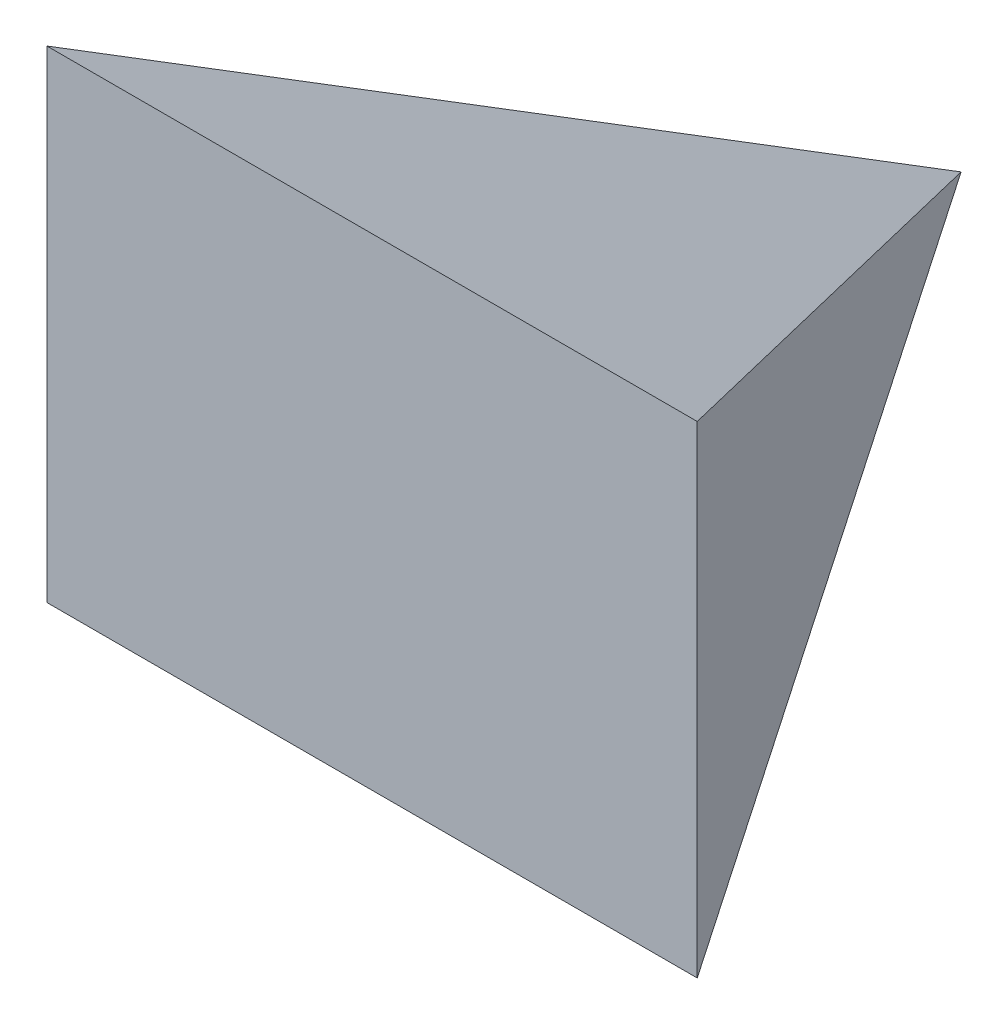
ISO-10303-21;
HEADER;
FILE_DESCRIPTION(('STEP AP214'),'2;1');
FILE_NAME('part.step','',(''),(''),'','','');
FILE_SCHEMA(('AUTOMOTIVE_DESIGN { 1 0 10303 214 1 1 1 1 }'));
ENDSEC;
DATA;
#1=APPLICATION_CONTEXT('core data for automotive mechanical design processes');
#2=APPLICATION_PROTOCOL_DEFINITION('international standard','automotive_design',2000,#1);
#3=PRODUCT_CONTEXT('',#1,'mechanical');
#4=PRODUCT('Part','Part','',(#3));
#5=PRODUCT_RELATED_PRODUCT_CATEGORY('part','',(#4));
#6=PRODUCT_DEFINITION_FORMATION('','',#4);
#7=PRODUCT_DEFINITION_CONTEXT('part definition',#1,'design');
#8=PRODUCT_DEFINITION('design','',#6,#7);
#9=PRODUCT_DEFINITION_SHAPE('','',#8);
#10=(LENGTH_UNIT() NAMED_UNIT(*) SI_UNIT(.MILLI.,.METRE.));
#11=(NAMED_UNIT(*) PLANE_ANGLE_UNIT() SI_UNIT($,.RADIAN.));
#12=(NAMED_UNIT(*) SI_UNIT($,.STERADIAN.) SOLID_ANGLE_UNIT());
#13=UNCERTAINTY_MEASURE_WITH_UNIT(LENGTH_MEASURE(1.E-05),#10,'distance_accuracy_value','');
#14=(GEOMETRIC_REPRESENTATION_CONTEXT(3) GLOBAL_UNCERTAINTY_ASSIGNED_CONTEXT((#13)) GLOBAL_UNIT_ASSIGNED_CONTEXT((#10,
#11,#12)) REPRESENTATION_CONTEXT('',''));
#15=CARTESIAN_POINT('',(0.,0.,0.));
#16=DIRECTION('',(0.,0.,1.));
#17=DIRECTION('',(1.,0.,0.));
#18=AXIS2_PLACEMENT_3D('',#15,#16,#17);
#19=CARTESIAN_POINT('',(165.608897339706,250.,300.));
#20=DIRECTION('',(-0.875464527000019,0.,0.483282383255));
#21=DIRECTION('',(0.483282383255,0.,0.875464527000019));
#22=AXIS2_PLACEMENT_3D('',#19,#20,#21);
#23=PLANE('',#22);
#24=DIRECTION('',(0.45498022040098,-0.337187178210936,0.824195247434746));
#25=VECTOR('',#24,1.);
#26=CARTESIAN_POINT('',(127.603274686984,30.432838191824,231.152933332871));
#27=LINE('',#26,#25);
#28=CARTESIAN_POINT('',(0.,125.,0.));
#29=VERTEX_POINT('',#28);
#30=CARTESIAN_POINT('',(165.608897339706,2.266759571688,300.));
#31=VERTEX_POINT('',#30);
#32=EDGE_CURVE('E64',#29,#31,#27,.T.);
#33=ORIENTED_EDGE('',*,*,#32,.F.);
#34=DIRECTION('',(-0.45498022040098,-0.337187178210936,-0.824195247434746));
#35=VECTOR('',#34,1.);
#36=CARTESIAN_POINT('',(165.956648851683,247.990960095639,300.629950777217));
#37=LINE('',#36,#35);
#38=CARTESIAN_POINT('',(165.608897339706,247.733240428312,300.));
#39=VERTEX_POINT('',#38);
#40=EDGE_CURVE('E78',#39,#29,#37,.T.);
#41=ORIENTED_EDGE('',*,*,#40,.F.);
#42=DIRECTION('',(0.,-1.,0.));
#43=VECTOR('',#42,1.);
#44=CARTESIAN_POINT('',(165.608897339706,250.,300.));
#45=LINE('',#44,#43);
#46=EDGE_CURVE('E42',#39,#31,#45,.T.);
#47=ORIENTED_EDGE('',*,*,#46,.T.);
#48=EDGE_LOOP('',(#33,#41,#47));
#49=FACE_BOUND('',#48,.T.);
#50=ADVANCED_FACE('F35',(#49),#23,.F.);
#51=CARTESIAN_POINT('',(0.,250.,0.));
#52=DIRECTION('',(0.875464527000019,0.,0.483282383255));
#53=DIRECTION('',(0.483282383255,0.,-0.875464527000019));
#54=AXIS2_PLACEMENT_3D('',#51,#52,#53);
#55=PLANE('',#54);
#56=DIRECTION('',(0.45498022040098,0.337187178210936,-0.824195247434746));
#57=VECTOR('',#56,1.);
#58=CARTESIAN_POINT('',(19.1766870823495,139.211899143732,-34.7385087221733));
#59=LINE('',#58,#57);
#60=CARTESIAN_POINT('',(-165.608897339706,2.266759571688,300.));
#61=VERTEX_POINT('',#60);
#62=EDGE_CURVE('E57',#61,#29,#59,.T.);
#63=ORIENTED_EDGE('',*,*,#62,.F.);
#64=DIRECTION('',(0.,-1.,0.));
#65=VECTOR('',#64,1.);
#66=CARTESIAN_POINT('',(-165.608897339706,250.,300.));
#67=LINE('',#66,#65);
#68=CARTESIAN_POINT('',(-165.608897339706,247.733240428312,300.));
#69=VERTEX_POINT('',#68);
#70=EDGE_CURVE('E12',#69,#61,#67,.T.);
#71=ORIENTED_EDGE('',*,*,#70,.F.);
#72=DIRECTION('',(-0.45498022040098,0.337187178210936,0.824195247434746));
#73=VECTOR('',#72,1.);
#74=CARTESIAN_POINT('',(-19.1766870823495,139.211899143732,34.7385087221732));
#75=LINE('',#74,#73);
#76=EDGE_CURVE('E49',#29,#69,#75,.T.);
#77=ORIENTED_EDGE('',*,*,#76,.F.);
#78=EDGE_LOOP('',(#63,#71,#77));
#79=FACE_BOUND('',#78,.T.);
#80=ADVANCED_FACE('F85',(#79),#55,.F.);
#81=CARTESIAN_POINT('',(-165.608897339706,250.,300.));
#82=DIRECTION('',(0.,0.,-1.));
#83=DIRECTION('',(-1.,0.,0.));
#84=AXIS2_PLACEMENT_3D('',#81,#82,#83);
#85=PLANE('',#84);
#86=DIRECTION('',(1.,0.,0.));
#87=VECTOR('',#86,1.);
#88=CARTESIAN_POINT('',(-165.608897339706,2.266759571688,300.));
#89=LINE('',#88,#87);
#90=EDGE_CURVE('E67',#61,#31,#89,.T.);
#91=ORIENTED_EDGE('',*,*,#90,.T.);
#92=ORIENTED_EDGE('',*,*,#46,.F.);
#93=DIRECTION('',(1.,0.,0.));
#94=VECTOR('',#93,1.);
#95=CARTESIAN_POINT('',(-165.608897339706,247.733240428312,300.));
#96=LINE('',#95,#94);
#97=EDGE_CURVE('E76',#69,#39,#96,.T.);
#98=ORIENTED_EDGE('',*,*,#97,.F.);
#99=ORIENTED_EDGE('',*,*,#70,.T.);
#100=EDGE_LOOP('',(#91,#92,#98,#99));
#101=FACE_BOUND('',#100,.T.);
#102=ADVANCED_FACE('F74',(#101),#85,.F.);
#103=CARTESIAN_POINT('',(-165.608897339706,125.,0.));
#104=DIRECTION('',(0.,0.925540504017567,-0.37864861735243));
#105=DIRECTION('',(0.,0.37864861735243,0.925540504017568));
#106=AXIS2_PLACEMENT_3D('',#103,#104,#105);
#107=PLANE('',#106);
#108=ORIENTED_EDGE('',*,*,#40,.T.);
#109=ORIENTED_EDGE('',*,*,#76,.T.);
#110=ORIENTED_EDGE('',*,*,#97,.T.);
#111=EDGE_LOOP('',(#108,#109,#110));
#112=FACE_BOUND('',#111,.T.);
#113=ADVANCED_FACE('F83',(#112),#107,.T.);
#114=CARTESIAN_POINT('',(-165.608897339706,2.266759571688,300.));
#115=DIRECTION('',(0.,-0.925540504017567,-0.37864861735243));
#116=DIRECTION('',(0.,0.37864861735243,-0.925540504017567));
#117=AXIS2_PLACEMENT_3D('',#114,#115,#116);
#118=PLANE('',#117);
#119=ORIENTED_EDGE('',*,*,#32,.T.);
#120=ORIENTED_EDGE('',*,*,#90,.F.);
#121=ORIENTED_EDGE('',*,*,#62,.T.);
#122=EDGE_LOOP('',(#119,#120,#121));
#123=FACE_BOUND('',#122,.T.);
#124=ADVANCED_FACE('F66',(#123),#118,.T.);
#125=CLOSED_SHELL('',(#50,#80,#102,#113,#124));
#126=MANIFOLD_SOLID_BREP('B2',#125);
#127=ADVANCED_BREP_SHAPE_REPRESENTATION('',(#18,#126),#14);
#128=SHAPE_DEFINITION_REPRESENTATION(#9,#127);
ENDSEC;
END-ISO-10303-21;
